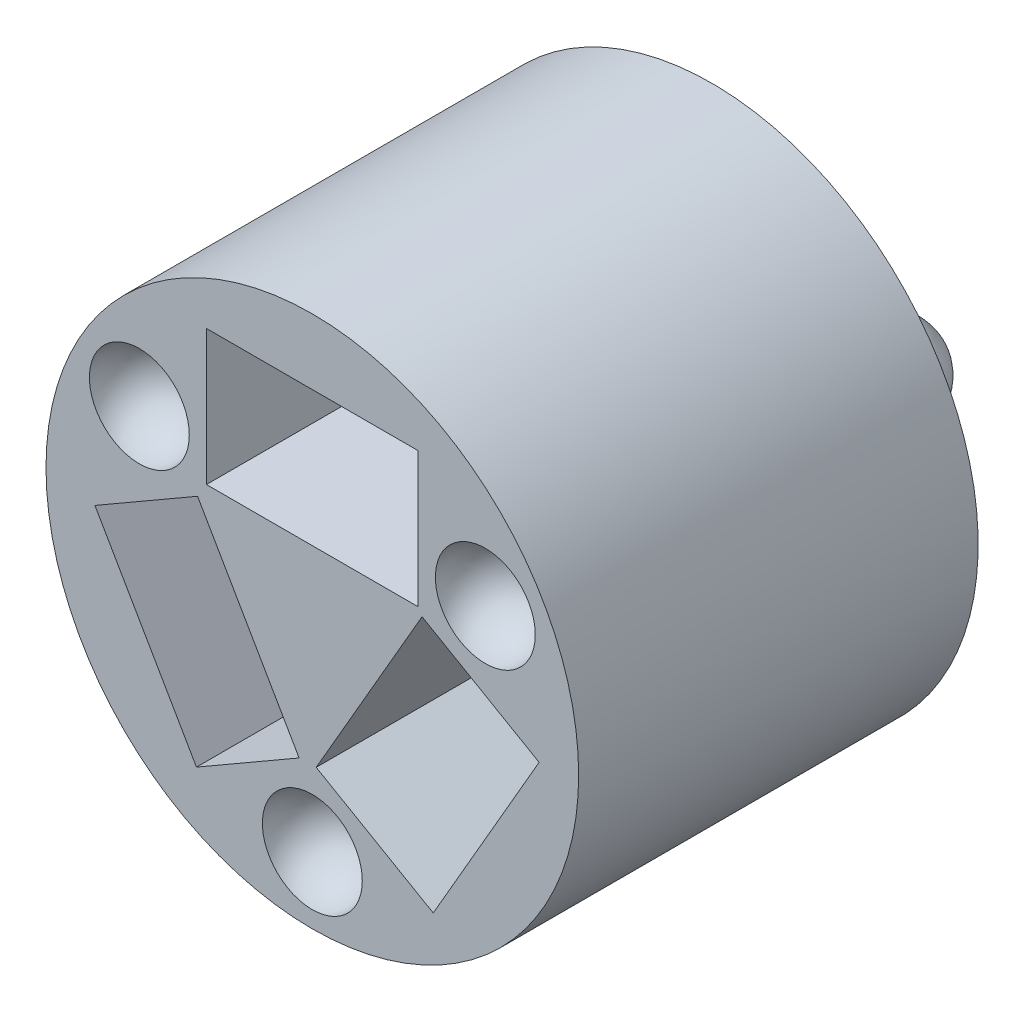
ISO-10303-21;
HEADER;
FILE_DESCRIPTION(('STEP AP214'),'2;1');
FILE_NAME('part.step','',(''),(''),'','','');
FILE_SCHEMA(('AUTOMOTIVE_DESIGN { 1 0 10303 214 1 1 1 1 }'));
ENDSEC;
DATA;
#1=APPLICATION_CONTEXT('core data for automotive mechanical design processes');
#2=APPLICATION_PROTOCOL_DEFINITION('international standard','automotive_design',2000,#1);
#3=PRODUCT_CONTEXT('',#1,'mechanical');
#4=PRODUCT('Part','Part','',(#3));
#5=PRODUCT_RELATED_PRODUCT_CATEGORY('part','',(#4));
#6=PRODUCT_DEFINITION_FORMATION('','',#4);
#7=PRODUCT_DEFINITION_CONTEXT('part definition',#1,'design');
#8=PRODUCT_DEFINITION('design','',#6,#7);
#9=PRODUCT_DEFINITION_SHAPE('','',#8);
#10=(LENGTH_UNIT() NAMED_UNIT(*) SI_UNIT(.MILLI.,.METRE.));
#11=(NAMED_UNIT(*) PLANE_ANGLE_UNIT() SI_UNIT($,.RADIAN.));
#12=(NAMED_UNIT(*) SI_UNIT($,.STERADIAN.) SOLID_ANGLE_UNIT());
#13=UNCERTAINTY_MEASURE_WITH_UNIT(LENGTH_MEASURE(1.E-05),#10,'distance_accuracy_value','');
#14=(GEOMETRIC_REPRESENTATION_CONTEXT(3) GLOBAL_UNCERTAINTY_ASSIGNED_CONTEXT((#13)) GLOBAL_UNIT_ASSIGNED_CONTEXT((#10,
#11,#12)) REPRESENTATION_CONTEXT('',''));
#15=CARTESIAN_POINT('',(0.,0.,0.));
#16=DIRECTION('',(0.,0.,1.));
#17=DIRECTION('',(1.,0.,0.));
#18=AXIS2_PLACEMENT_3D('',#15,#16,#17);
#19=CARTESIAN_POINT('',(0.,0.,5.));
#20=DIRECTION('',(0.,0.,1.));
#21=DIRECTION('',(1.,0.,0.));
#22=AXIS2_PLACEMENT_3D('',#19,#20,#21);
#23=PLANE('',#22);
#24=CARTESIAN_POINT('',(0.,-3.,5.));
#25=DIRECTION('',(0.,0.,1.));
#26=DIRECTION('',(1.,0.,0.));
#27=AXIS2_PLACEMENT_3D('',#24,#25,#26);
#28=CIRCLE('',#27,0.75);
#29=CARTESIAN_POINT('',(0.75,-3.,5.));
#30=VERTEX_POINT('',#29);
#31=EDGE_CURVE('E326',#30,#30,#28,.T.);
#32=ORIENTED_EDGE('',*,*,#31,.F.);
#33=EDGE_LOOP('',(#32));
#34=FACE_BOUND('',#33,.T.);
#35=CARTESIAN_POINT('',(-2.59807621135331,1.50000000000001,5.));
#36=DIRECTION('',(0.,0.,1.));
#37=DIRECTION('',(1.,0.,0.));
#38=AXIS2_PLACEMENT_3D('',#35,#36,#37);
#39=CIRCLE('',#38,0.75);
#40=CARTESIAN_POINT('',(-1.84807621135331,1.50000000000001,5.));
#41=VERTEX_POINT('',#40);
#42=EDGE_CURVE('E322',#41,#41,#39,.T.);
#43=ORIENTED_EDGE('',*,*,#42,.F.);
#44=EDGE_LOOP('',(#43));
#45=FACE_BOUND('',#44,.T.);
#46=CARTESIAN_POINT('',(2.59807621135333,1.49999999999998,5.));
#47=DIRECTION('',(0.,0.,1.));
#48=DIRECTION('',(1.,0.,0.));
#49=AXIS2_PLACEMENT_3D('',#46,#47,#48);
#50=CIRCLE('',#49,0.75);
#51=CARTESIAN_POINT('',(3.34807621135333,1.49999999999998,5.));
#52=VERTEX_POINT('',#51);
#53=EDGE_CURVE('E319',#52,#52,#50,.T.);
#54=ORIENTED_EDGE('',*,*,#53,.F.);
#55=EDGE_LOOP('',(#54));
#56=FACE_BOUND('',#55,.T.);
#57=CARTESIAN_POINT('',(0.,0.,5.));
#58=DIRECTION('',(0.,0.,1.));
#59=DIRECTION('',(1.,0.,0.));
#60=AXIS2_PLACEMENT_3D('',#57,#58,#59);
#61=CIRCLE('',#60,4.);
#62=CARTESIAN_POINT('',(4.,0.,5.));
#63=VERTEX_POINT('',#62);
#64=EDGE_CURVE('E11',#63,#63,#61,.T.);
#65=ORIENTED_EDGE('',*,*,#64,.T.);
#66=EDGE_LOOP('',(#65));
#67=FACE_BOUND('',#66,.T.);
#68=DIRECTION('',(-1.,0.,0.));
#69=VECTOR('',#68,1.);
#70=CARTESIAN_POINT('',(-1.59,3.015,5.));
#71=LINE('',#70,#69);
#72=CARTESIAN_POINT('',(1.59,3.015,5.));
#73=VERTEX_POINT('',#72);
#74=CARTESIAN_POINT('',(-1.59,3.015,5.));
#75=VERTEX_POINT('',#74);
#76=EDGE_CURVE('E215',#73,#75,#71,.T.);
#77=ORIENTED_EDGE('',*,*,#76,.F.);
#78=DIRECTION('',(0.,1.,0.));
#79=VECTOR('',#78,1.);
#80=CARTESIAN_POINT('',(1.59,0.985,5.));
#81=LINE('',#80,#79);
#82=CARTESIAN_POINT('',(1.59,0.985,5.));
#83=VERTEX_POINT('',#82);
#84=EDGE_CURVE('E212',#83,#73,#81,.T.);
#85=ORIENTED_EDGE('',*,*,#84,.F.);
#86=DIRECTION('',(1.,0.,0.));
#87=VECTOR('',#86,1.);
#88=CARTESIAN_POINT('',(-1.59,0.985,5.));
#89=LINE('',#88,#87);
#90=CARTESIAN_POINT('',(-1.59,0.985,5.));
#91=VERTEX_POINT('',#90);
#92=EDGE_CURVE('E223',#91,#83,#89,.T.);
#93=ORIENTED_EDGE('',*,*,#92,.F.);
#94=DIRECTION('',(0.,-1.,0.));
#95=VECTOR('',#94,1.);
#96=CARTESIAN_POINT('',(-1.59,0.985,5.));
#97=LINE('',#96,#95);
#98=EDGE_CURVE('E219',#75,#91,#97,.T.);
#99=ORIENTED_EDGE('',*,*,#98,.F.);
#100=EDGE_LOOP('',(#77,#85,#93,#99));
#101=FACE_BOUND('',#100,.T.);
#102=DIRECTION('',(0.866025403784439,0.5,0.));
#103=VECTOR('',#102,1.);
#104=CARTESIAN_POINT('',(-1.74031341693703,-2.76568874077127,5.));
#105=LINE('',#104,#103);
#106=CARTESIAN_POINT('',(-1.74031341693703,-2.76568874077127,5.));
#107=VERTEX_POINT('',#106);
#108=CARTESIAN_POINT('',(-0.198788198200727,-1.87568874077127,5.));
#109=VERTEX_POINT('',#108);
#110=EDGE_CURVE('E175',#107,#109,#105,.T.);
#111=ORIENTED_EDGE('',*,*,#110,.F.);
#112=DIRECTION('',(0.5,-0.866025403784439,0.));
#113=VECTOR('',#112,1.);
#114=CARTESIAN_POINT('',(-1.74031341693703,-2.76568874077127,5.));
#115=LINE('',#114,#113);
#116=CARTESIAN_POINT('',(-3.26531341693703,-0.124311259228731,5.));
#117=VERTEX_POINT('',#116);
#118=EDGE_CURVE('E172',#117,#107,#115,.T.);
#119=ORIENTED_EDGE('',*,*,#118,.F.);
#120=DIRECTION('',(-0.866025403784439,-0.5,0.));
#121=VECTOR('',#120,1.);
#122=CARTESIAN_POINT('',(-3.26531341693703,-0.124311259228731,5.));
#123=LINE('',#122,#121);
#124=CARTESIAN_POINT('',(-1.72378819820073,0.765688740771268,5.));
#125=VERTEX_POINT('',#124);
#126=EDGE_CURVE('E182',#125,#117,#123,.T.);
#127=ORIENTED_EDGE('',*,*,#126,.F.);
#128=DIRECTION('',(-0.5,0.866025403784439,0.));
#129=VECTOR('',#128,1.);
#130=CARTESIAN_POINT('',(-0.198788198200727,-1.87568874077127,5.));
#131=LINE('',#130,#129);
#132=EDGE_CURVE('E179',#109,#125,#131,.T.);
#133=ORIENTED_EDGE('',*,*,#132,.F.);
#134=EDGE_LOOP('',(#111,#119,#127,#133));
#135=FACE_BOUND('',#134,.T.);
#136=DIRECTION('',(-0.866025403784438,0.5,0.));
#137=VECTOR('',#136,1.);
#138=CARTESIAN_POINT('',(3.40606659241008,-0.130519607982743,5.));
#139=LINE('',#138,#137);
#140=CARTESIAN_POINT('',(3.40606659241008,-0.130519607982743,5.));
#141=VERTEX_POINT('',#140);
#142=CARTESIAN_POINT('',(1.64803502272767,0.884480392017257,5.));
#143=VERTEX_POINT('',#142);
#144=EDGE_CURVE('E159',#141,#143,#139,.T.);
#145=ORIENTED_EDGE('',*,*,#144,.F.);
#146=DIRECTION('',(0.5,0.866025403784438,0.));
#147=VECTOR('',#146,1.);
#148=CARTESIAN_POINT('',(3.40606659241008,-0.130519607982743,5.));
#149=LINE('',#148,#147);
#150=CARTESIAN_POINT('',(1.81606659241008,-2.88448039201726,5.));
#151=VERTEX_POINT('',#150);
#152=EDGE_CURVE('E155',#151,#141,#149,.T.);
#153=ORIENTED_EDGE('',*,*,#152,.F.);
#154=DIRECTION('',(0.866025403784439,-0.5,0.));
#155=VECTOR('',#154,1.);
#156=CARTESIAN_POINT('',(1.81606659241008,-2.88448039201726,5.));
#157=LINE('',#156,#155);
#158=CARTESIAN_POINT('',(0.0580350227276713,-1.86948039201726,5.));
#159=VERTEX_POINT('',#158);
#160=EDGE_CURVE('E134',#159,#151,#157,.T.);
#161=ORIENTED_EDGE('',*,*,#160,.F.);
#162=DIRECTION('',(-0.5,-0.866025403784438,0.));
#163=VECTOR('',#162,1.);
#164=CARTESIAN_POINT('',(1.64803502272767,0.884480392017257,5.));
#165=LINE('',#164,#163);
#166=EDGE_CURVE('E371',#143,#159,#165,.T.);
#167=ORIENTED_EDGE('',*,*,#166,.F.);
#168=EDGE_LOOP('',(#145,#153,#161,#167));
#169=FACE_BOUND('',#168,.T.);
#170=ADVANCED_FACE('F39',(#34,#45,#56,#67,#101,#135,#169),#23,.T.);
#171=CARTESIAN_POINT('',(0.,0.,5.));
#172=DIRECTION('',(0.,0.,-1.));
#173=DIRECTION('',(-1.,0.,0.));
#174=AXIS2_PLACEMENT_3D('',#171,#172,#173);
#175=CYLINDRICAL_SURFACE('',#174,4.);
#176=ORIENTED_EDGE('',*,*,#64,.F.);
#177=EDGE_LOOP('',(#176));
#178=FACE_BOUND('',#177,.T.);
#179=CARTESIAN_POINT('',(0.,0.,-1.));
#180=DIRECTION('',(0.,0.,-1.));
#181=DIRECTION('',(-1.,0.,0.));
#182=AXIS2_PLACEMENT_3D('',#179,#180,#181);
#183=CIRCLE('',#182,4.);
#184=CARTESIAN_POINT('',(-4.,0.,-1.));
#185=VERTEX_POINT('',#184);
#186=EDGE_CURVE('E149',#185,#185,#183,.T.);
#187=ORIENTED_EDGE('',*,*,#186,.F.);
#188=EDGE_LOOP('',(#187));
#189=FACE_BOUND('',#188,.T.);
#190=ADVANCED_FACE('F282',(#178,#189),#175,.T.);
#191=CARTESIAN_POINT('',(1.59,0.985,5.));
#192=DIRECTION('',(-1.,0.,0.));
#193=DIRECTION('',(0.,0.,1.));
#194=AXIS2_PLACEMENT_3D('',#191,#192,#193);
#195=PLANE('',#194);
#196=DIRECTION('',(0.,1.,0.));
#197=VECTOR('',#196,1.);
#198=CARTESIAN_POINT('',(1.59,0.985,0.));
#199=LINE('',#198,#197);
#200=CARTESIAN_POINT('',(1.59,0.985,0.));
#201=VERTEX_POINT('',#200);
#202=CARTESIAN_POINT('',(1.59,3.015,0.));
#203=VERTEX_POINT('',#202);
#204=EDGE_CURVE('E211',#201,#203,#199,.T.);
#205=ORIENTED_EDGE('',*,*,#204,.F.);
#206=DIRECTION('',(0.,0.,-1.));
#207=VECTOR('',#206,1.);
#208=CARTESIAN_POINT('',(1.59,0.985,5.));
#209=LINE('',#208,#207);
#210=EDGE_CURVE('E226',#83,#201,#209,.T.);
#211=ORIENTED_EDGE('',*,*,#210,.F.);
#212=ORIENTED_EDGE('',*,*,#84,.T.);
#213=DIRECTION('',(0.,0.,-1.));
#214=VECTOR('',#213,1.);
#215=CARTESIAN_POINT('',(1.59,3.015,5.));
#216=LINE('',#215,#214);
#217=EDGE_CURVE('E48',#73,#203,#216,.T.);
#218=ORIENTED_EDGE('',*,*,#217,.T.);
#219=EDGE_LOOP('',(#205,#211,#212,#218));
#220=FACE_BOUND('',#219,.T.);
#221=ADVANCED_FACE('F253',(#220),#195,.T.);
#222=CARTESIAN_POINT('',(-1.59,3.015,5.));
#223=DIRECTION('',(0.,-1.,0.));
#224=DIRECTION('',(0.,0.,-1.));
#225=AXIS2_PLACEMENT_3D('',#222,#223,#224);
#226=PLANE('',#225);
#227=DIRECTION('',(-1.,0.,0.));
#228=VECTOR('',#227,1.);
#229=CARTESIAN_POINT('',(-1.59,3.015,0.));
#230=LINE('',#229,#228);
#231=CARTESIAN_POINT('',(-1.59,3.015,0.));
#232=VERTEX_POINT('',#231);
#233=EDGE_CURVE('E230',#203,#232,#230,.T.);
#234=ORIENTED_EDGE('',*,*,#233,.F.);
#235=ORIENTED_EDGE('',*,*,#217,.F.);
#236=ORIENTED_EDGE('',*,*,#76,.T.);
#237=DIRECTION('',(0.,0.,-1.));
#238=VECTOR('',#237,1.);
#239=CARTESIAN_POINT('',(-1.59,3.015,5.));
#240=LINE('',#239,#238);
#241=EDGE_CURVE('E246',#75,#232,#240,.T.);
#242=ORIENTED_EDGE('',*,*,#241,.T.);
#243=EDGE_LOOP('',(#234,#235,#236,#242));
#244=FACE_BOUND('',#243,.T.);
#245=ADVANCED_FACE('F269',(#244),#226,.T.);
#246=CARTESIAN_POINT('',(-1.59,0.985,5.));
#247=DIRECTION('',(1.,0.,0.));
#248=DIRECTION('',(0.,0.,-1.));
#249=AXIS2_PLACEMENT_3D('',#246,#247,#248);
#250=PLANE('',#249);
#251=DIRECTION('',(0.,-1.,0.));
#252=VECTOR('',#251,1.);
#253=CARTESIAN_POINT('',(-1.59,0.985,0.));
#254=LINE('',#253,#252);
#255=CARTESIAN_POINT('',(-1.59,0.985,0.));
#256=VERTEX_POINT('',#255);
#257=EDGE_CURVE('E234',#232,#256,#254,.T.);
#258=ORIENTED_EDGE('',*,*,#257,.F.);
#259=ORIENTED_EDGE('',*,*,#241,.F.);
#260=ORIENTED_EDGE('',*,*,#98,.T.);
#261=DIRECTION('',(0.,0.,-1.));
#262=VECTOR('',#261,1.);
#263=CARTESIAN_POINT('',(-1.59,0.985,5.));
#264=LINE('',#263,#262);
#265=EDGE_CURVE('E243',#91,#256,#264,.T.);
#266=ORIENTED_EDGE('',*,*,#265,.T.);
#267=EDGE_LOOP('',(#258,#259,#260,#266));
#268=FACE_BOUND('',#267,.T.);
#269=ADVANCED_FACE('F271',(#268),#250,.T.);
#270=CARTESIAN_POINT('',(-1.59,0.985,5.));
#271=DIRECTION('',(0.,1.,0.));
#272=DIRECTION('',(0.,0.,1.));
#273=AXIS2_PLACEMENT_3D('',#270,#271,#272);
#274=PLANE('',#273);
#275=DIRECTION('',(1.,0.,0.));
#276=VECTOR('',#275,1.);
#277=CARTESIAN_POINT('',(-1.59,0.985,0.));
#278=LINE('',#277,#276);
#279=EDGE_CURVE('E216',#256,#201,#278,.T.);
#280=ORIENTED_EDGE('',*,*,#279,.F.);
#281=ORIENTED_EDGE('',*,*,#265,.F.);
#282=ORIENTED_EDGE('',*,*,#92,.T.);
#283=ORIENTED_EDGE('',*,*,#210,.T.);
#284=EDGE_LOOP('',(#280,#281,#282,#283));
#285=FACE_BOUND('',#284,.T.);
#286=ADVANCED_FACE('F263',(#285),#274,.T.);
#287=CARTESIAN_POINT('',(-1.74031341693703,-2.76568874077127,5.));
#288=DIRECTION('',(0.866025403784439,0.5,0.));
#289=DIRECTION('',(-0.5,0.866025403784439,0.));
#290=AXIS2_PLACEMENT_3D('',#287,#288,#289);
#291=PLANE('',#290);
#292=DIRECTION('',(0.5,-0.866025403784439,0.));
#293=VECTOR('',#292,1.);
#294=CARTESIAN_POINT('',(-1.74031341693703,-2.76568874077127,0.));
#295=LINE('',#294,#293);
#296=CARTESIAN_POINT('',(-3.26531341693703,-0.124311259228732,0.));
#297=VERTEX_POINT('',#296);
#298=CARTESIAN_POINT('',(-1.74031341693703,-2.76568874077127,0.));
#299=VERTEX_POINT('',#298);
#300=EDGE_CURVE('E171',#297,#299,#295,.T.);
#301=ORIENTED_EDGE('',*,*,#300,.F.);
#302=DIRECTION('',(0.,0.,-1.));
#303=VECTOR('',#302,1.);
#304=CARTESIAN_POINT('',(-3.26531341693703,-0.124311259228731,5.));
#305=LINE('',#304,#303);
#306=EDGE_CURVE('E185',#117,#297,#305,.T.);
#307=ORIENTED_EDGE('',*,*,#306,.F.);
#308=ORIENTED_EDGE('',*,*,#118,.T.);
#309=DIRECTION('',(0.,0.,-1.));
#310=VECTOR('',#309,1.);
#311=CARTESIAN_POINT('',(-1.74031341693703,-2.76568874077127,5.));
#312=LINE('',#311,#310);
#313=EDGE_CURVE('E207',#107,#299,#312,.T.);
#314=ORIENTED_EDGE('',*,*,#313,.T.);
#315=EDGE_LOOP('',(#301,#307,#308,#314));
#316=FACE_BOUND('',#315,.T.);
#317=ADVANCED_FACE('F278',(#316),#291,.T.);
#318=CARTESIAN_POINT('',(-1.74031341693703,-2.76568874077127,5.));
#319=DIRECTION('',(-0.5,0.866025403784439,0.));
#320=DIRECTION('',(-0.866025403784439,-0.5,0.));
#321=AXIS2_PLACEMENT_3D('',#318,#319,#320);
#322=PLANE('',#321);
#323=DIRECTION('',(0.866025403784439,0.5,0.));
#324=VECTOR('',#323,1.);
#325=CARTESIAN_POINT('',(-1.74031341693703,-2.76568874077127,0.));
#326=LINE('',#325,#324);
#327=CARTESIAN_POINT('',(-0.198788198200727,-1.87568874077127,0.));
#328=VERTEX_POINT('',#327);
#329=EDGE_CURVE('E189',#299,#328,#326,.T.);
#330=ORIENTED_EDGE('',*,*,#329,.F.);
#331=ORIENTED_EDGE('',*,*,#313,.F.);
#332=ORIENTED_EDGE('',*,*,#110,.T.);
#333=DIRECTION('',(0.,0.,-1.));
#334=VECTOR('',#333,1.);
#335=CARTESIAN_POINT('',(-0.198788198200727,-1.87568874077127,5.));
#336=LINE('',#335,#334);
#337=EDGE_CURVE('E204',#109,#328,#336,.T.);
#338=ORIENTED_EDGE('',*,*,#337,.T.);
#339=EDGE_LOOP('',(#330,#331,#332,#338));
#340=FACE_BOUND('',#339,.T.);
#341=ADVANCED_FACE('F403',(#340),#322,.T.);
#342=CARTESIAN_POINT('',(-0.198788198200727,-1.87568874077127,5.));
#343=DIRECTION('',(-0.866025403784439,-0.5,0.));
#344=DIRECTION('',(0.5,-0.866025403784439,0.));
#345=AXIS2_PLACEMENT_3D('',#342,#343,#344);
#346=PLANE('',#345);
#347=DIRECTION('',(-0.5,0.866025403784439,0.));
#348=VECTOR('',#347,1.);
#349=CARTESIAN_POINT('',(-0.198788198200727,-1.87568874077127,0.));
#350=LINE('',#349,#348);
#351=CARTESIAN_POINT('',(-1.72378819820073,0.765688740771268,0.));
#352=VERTEX_POINT('',#351);
#353=EDGE_CURVE('E193',#328,#352,#350,.T.);
#354=ORIENTED_EDGE('',*,*,#353,.F.);
#355=ORIENTED_EDGE('',*,*,#337,.F.);
#356=ORIENTED_EDGE('',*,*,#132,.T.);
#357=DIRECTION('',(0.,0.,-1.));
#358=VECTOR('',#357,1.);
#359=CARTESIAN_POINT('',(-1.72378819820073,0.765688740771268,5.));
#360=LINE('',#359,#358);
#361=EDGE_CURVE('E63',#125,#352,#360,.T.);
#362=ORIENTED_EDGE('',*,*,#361,.T.);
#363=EDGE_LOOP('',(#354,#355,#356,#362));
#364=FACE_BOUND('',#363,.T.);
#365=ADVANCED_FACE('F400',(#364),#346,.T.);
#366=CARTESIAN_POINT('',(-3.26531341693703,-0.124311259228731,5.));
#367=DIRECTION('',(0.5,-0.866025403784439,0.));
#368=DIRECTION('',(0.866025403784439,0.5,0.));
#369=AXIS2_PLACEMENT_3D('',#366,#367,#368);
#370=PLANE('',#369);
#371=DIRECTION('',(-0.866025403784439,-0.5,0.));
#372=VECTOR('',#371,1.);
#373=CARTESIAN_POINT('',(-3.26531341693703,-0.124311259228731,0.));
#374=LINE('',#373,#372);
#375=EDGE_CURVE('E176',#352,#297,#374,.T.);
#376=ORIENTED_EDGE('',*,*,#375,.F.);
#377=ORIENTED_EDGE('',*,*,#361,.F.);
#378=ORIENTED_EDGE('',*,*,#126,.T.);
#379=ORIENTED_EDGE('',*,*,#306,.T.);
#380=EDGE_LOOP('',(#376,#377,#378,#379));
#381=FACE_BOUND('',#380,.T.);
#382=ADVANCED_FACE('F397',(#381),#370,.T.);
#383=CARTESIAN_POINT('',(3.40606659241008,-0.130519607982743,5.));
#384=DIRECTION('',(-0.866025403784439,0.5,0.));
#385=DIRECTION('',(-0.5,-0.866025403784439,0.));
#386=AXIS2_PLACEMENT_3D('',#383,#384,#385);
#387=PLANE('',#386);
#388=DIRECTION('',(0.5,0.866025403784438,0.));
#389=VECTOR('',#388,1.);
#390=CARTESIAN_POINT('',(3.40606659241008,-0.130519607982743,0.));
#391=LINE('',#390,#389);
#392=CARTESIAN_POINT('',(1.81606659241008,-2.88448039201726,0.));
#393=VERTEX_POINT('',#392);
#394=CARTESIAN_POINT('',(3.40606659241008,-0.130519607982743,0.));
#395=VERTEX_POINT('',#394);
#396=EDGE_CURVE('E141',#393,#395,#391,.T.);
#397=ORIENTED_EDGE('',*,*,#396,.F.);
#398=DIRECTION('',(0.,0.,-1.));
#399=VECTOR('',#398,1.);
#400=CARTESIAN_POINT('',(1.81606659241008,-2.88448039201726,5.));
#401=LINE('',#400,#399);
#402=EDGE_CURVE('E127',#151,#393,#401,.T.);
#403=ORIENTED_EDGE('',*,*,#402,.F.);
#404=ORIENTED_EDGE('',*,*,#152,.T.);
#405=DIRECTION('',(0.,0.,-1.));
#406=VECTOR('',#405,1.);
#407=CARTESIAN_POINT('',(3.40606659241008,-0.130519607982743,5.));
#408=LINE('',#407,#406);
#409=EDGE_CURVE('E144',#141,#395,#408,.T.);
#410=ORIENTED_EDGE('',*,*,#409,.T.);
#411=EDGE_LOOP('',(#397,#403,#404,#410));
#412=FACE_BOUND('',#411,.T.);
#413=ADVANCED_FACE('F142',(#412),#387,.T.);
#414=CARTESIAN_POINT('',(3.40606659241008,-0.130519607982743,5.));
#415=DIRECTION('',(-0.5,-0.866025403784438,0.));
#416=DIRECTION('',(0.866025403784439,-0.5,0.));
#417=AXIS2_PLACEMENT_3D('',#414,#415,#416);
#418=PLANE('',#417);
#419=DIRECTION('',(-0.866025403784438,0.5,0.));
#420=VECTOR('',#419,1.);
#421=CARTESIAN_POINT('',(3.40606659241008,-0.130519607982743,0.));
#422=LINE('',#421,#420);
#423=CARTESIAN_POINT('',(1.64803502272767,0.884480392017257,0.));
#424=VERTEX_POINT('',#423);
#425=EDGE_CURVE('E148',#395,#424,#422,.T.);
#426=ORIENTED_EDGE('',*,*,#425,.F.);
#427=ORIENTED_EDGE('',*,*,#409,.F.);
#428=ORIENTED_EDGE('',*,*,#144,.T.);
#429=DIRECTION('',(0.,0.,-1.));
#430=VECTOR('',#429,1.);
#431=CARTESIAN_POINT('',(1.64803502272767,0.884480392017257,5.));
#432=LINE('',#431,#430);
#433=EDGE_CURVE('E166',#143,#424,#432,.T.);
#434=ORIENTED_EDGE('',*,*,#433,.T.);
#435=EDGE_LOOP('',(#426,#427,#428,#434));
#436=FACE_BOUND('',#435,.T.);
#437=ADVANCED_FACE('F377',(#436),#418,.T.);
#438=CARTESIAN_POINT('',(1.64803502272767,0.884480392017257,5.));
#439=DIRECTION('',(0.866025403784438,-0.5,0.));
#440=DIRECTION('',(0.5,0.866025403784439,0.));
#441=AXIS2_PLACEMENT_3D('',#438,#439,#440);
#442=PLANE('',#441);
#443=DIRECTION('',(-0.5,-0.866025403784438,0.));
#444=VECTOR('',#443,1.);
#445=CARTESIAN_POINT('',(1.64803502272767,0.884480392017257,0.));
#446=LINE('',#445,#444);
#447=CARTESIAN_POINT('',(0.0580350227276712,-1.86948039201726,0.));
#448=VERTEX_POINT('',#447);
#449=EDGE_CURVE('E153',#424,#448,#446,.T.);
#450=ORIENTED_EDGE('',*,*,#449,.F.);
#451=ORIENTED_EDGE('',*,*,#433,.F.);
#452=ORIENTED_EDGE('',*,*,#166,.T.);
#453=DIRECTION('',(0.,0.,-1.));
#454=VECTOR('',#453,1.);
#455=CARTESIAN_POINT('',(0.0580350227276712,-1.86948039201726,5.));
#456=LINE('',#455,#454);
#457=EDGE_CURVE('E55',#159,#448,#456,.T.);
#458=ORIENTED_EDGE('',*,*,#457,.T.);
#459=EDGE_LOOP('',(#450,#451,#452,#458));
#460=FACE_BOUND('',#459,.T.);
#461=ADVANCED_FACE('F382',(#460),#442,.T.);
#462=CARTESIAN_POINT('',(1.81606659241008,-2.88448039201726,5.));
#463=DIRECTION('',(0.5,0.866025403784439,0.));
#464=DIRECTION('',(-0.866025403784439,0.5,0.));
#465=AXIS2_PLACEMENT_3D('',#462,#463,#464);
#466=PLANE('',#465);
#467=DIRECTION('',(0.866025403784439,-0.5,0.));
#468=VECTOR('',#467,1.);
#469=CARTESIAN_POINT('',(1.81606659241008,-2.88448039201726,0.));
#470=LINE('',#469,#468);
#471=EDGE_CURVE('E131',#448,#393,#470,.T.);
#472=ORIENTED_EDGE('',*,*,#471,.F.);
#473=ORIENTED_EDGE('',*,*,#457,.F.);
#474=ORIENTED_EDGE('',*,*,#160,.T.);
#475=ORIENTED_EDGE('',*,*,#402,.T.);
#476=EDGE_LOOP('',(#472,#473,#474,#475));
#477=FACE_BOUND('',#476,.T.);
#478=ADVANCED_FACE('F129',(#477),#466,.T.);
#479=CARTESIAN_POINT('',(0.,0.,0.));
#480=DIRECTION('',(0.,0.,-1.));
#481=DIRECTION('',(-1.,0.,0.));
#482=AXIS2_PLACEMENT_3D('',#479,#480,#481);
#483=PLANE('',#482);
#484=CARTESIAN_POINT('',(-1.73205080756896,-0.999999999999951,0.));
#485=DIRECTION('',(0.,0.,-1.));
#486=DIRECTION('',(-1.,0.,0.));
#487=AXIS2_PLACEMENT_3D('',#484,#485,#486);
#488=CIRCLE('',#487,0.635000000000076);
#489=CARTESIAN_POINT('',(-2.36705080756904,-0.999999999999951,0.));
#490=VERTEX_POINT('',#489);
#491=EDGE_CURVE('E347',#490,#490,#488,.T.);
#492=ORIENTED_EDGE('',*,*,#491,.T.);
#493=EDGE_LOOP('',(#492));
#494=FACE_BOUND('',#493,.T.);
#495=ORIENTED_EDGE('',*,*,#375,.T.);
#496=ORIENTED_EDGE('',*,*,#300,.T.);
#497=ORIENTED_EDGE('',*,*,#329,.T.);
#498=ORIENTED_EDGE('',*,*,#353,.T.);
#499=EDGE_LOOP('',(#495,#496,#497,#498));
#500=FACE_BOUND('',#499,.T.);
#501=ADVANCED_FACE('F390',(#494,#500),#483,.F.);
#502=CARTESIAN_POINT('',(0.,2.,0.));
#503=DIRECTION('',(0.,0.,-1.));
#504=DIRECTION('',(-1.,0.,0.));
#505=AXIS2_PLACEMENT_3D('',#502,#503,#504);
#506=CIRCLE('',#505,0.635);
#507=CARTESIAN_POINT('',(-0.635,2.,0.));
#508=VERTEX_POINT('',#507);
#509=EDGE_CURVE('E355',#508,#508,#506,.T.);
#510=ORIENTED_EDGE('',*,*,#509,.T.);
#511=EDGE_LOOP('',(#510));
#512=FACE_BOUND('',#511,.T.);
#513=ORIENTED_EDGE('',*,*,#279,.T.);
#514=ORIENTED_EDGE('',*,*,#204,.T.);
#515=ORIENTED_EDGE('',*,*,#233,.T.);
#516=ORIENTED_EDGE('',*,*,#257,.T.);
#517=EDGE_LOOP('',(#513,#514,#515,#516));
#518=FACE_BOUND('',#517,.T.);
#519=ADVANCED_FACE('F259',(#512,#518),#483,.F.);
#520=CARTESIAN_POINT('',(1.73205080756879,-1.00000000000005,0.));
#521=DIRECTION('',(0.,0.,-1.));
#522=DIRECTION('',(-1.,0.,0.));
#523=AXIS2_PLACEMENT_3D('',#520,#521,#522);
#524=CIRCLE('',#523,0.635000000000114);
#525=CARTESIAN_POINT('',(1.09705080756868,-1.00000000000005,0.));
#526=VERTEX_POINT('',#525);
#527=EDGE_CURVE('E342',#526,#526,#524,.T.);
#528=ORIENTED_EDGE('',*,*,#527,.T.);
#529=EDGE_LOOP('',(#528));
#530=FACE_BOUND('',#529,.T.);
#531=ORIENTED_EDGE('',*,*,#471,.T.);
#532=ORIENTED_EDGE('',*,*,#396,.T.);
#533=ORIENTED_EDGE('',*,*,#425,.T.);
#534=ORIENTED_EDGE('',*,*,#449,.T.);
#535=EDGE_LOOP('',(#531,#532,#533,#534));
#536=FACE_BOUND('',#535,.T.);
#537=ADVANCED_FACE('F151',(#530,#536),#483,.F.);
#538=CARTESIAN_POINT('',(0.,0.,-1.));
#539=DIRECTION('',(0.,0.,-1.));
#540=DIRECTION('',(-1.,0.,0.));
#541=AXIS2_PLACEMENT_3D('',#538,#539,#540);
#542=PLANE('',#541);
#543=CARTESIAN_POINT('',(-2.59807621135333,1.49999999999998,-1.));
#544=DIRECTION('',(0.,0.,-1.));
#545=DIRECTION('',(-1.,0.,0.));
#546=AXIS2_PLACEMENT_3D('',#543,#544,#545);
#547=CIRCLE('',#546,0.725);
#548=CARTESIAN_POINT('',(-3.32307621135333,1.49999999999998,-1.));
#549=VERTEX_POINT('',#548);
#550=EDGE_CURVE('E330',#549,#549,#547,.T.);
#551=ORIENTED_EDGE('',*,*,#550,.F.);
#552=EDGE_LOOP('',(#551));
#553=FACE_BOUND('',#552,.T.);
#554=CARTESIAN_POINT('',(2.59807621135331,1.50000000000001,-1.));
#555=DIRECTION('',(0.,0.,-1.));
#556=DIRECTION('',(-1.,0.,0.));
#557=AXIS2_PLACEMENT_3D('',#554,#555,#556);
#558=CIRCLE('',#557,0.725);
#559=CARTESIAN_POINT('',(1.87307621135331,1.50000000000001,-1.));
#560=VERTEX_POINT('',#559);
#561=EDGE_CURVE('E334',#560,#560,#558,.T.);
#562=ORIENTED_EDGE('',*,*,#561,.F.);
#563=EDGE_LOOP('',(#562));
#564=FACE_BOUND('',#563,.T.);
#565=CARTESIAN_POINT('',(0.,-3.,-1.));
#566=DIRECTION('',(0.,0.,-1.));
#567=DIRECTION('',(-1.,0.,0.));
#568=AXIS2_PLACEMENT_3D('',#565,#566,#567);
#569=CIRCLE('',#568,0.725);
#570=CARTESIAN_POINT('',(-0.725,-3.,-1.));
#571=VERTEX_POINT('',#570);
#572=EDGE_CURVE('E338',#571,#571,#569,.T.);
#573=ORIENTED_EDGE('',*,*,#572,.F.);
#574=EDGE_LOOP('',(#573));
#575=FACE_BOUND('',#574,.T.);
#576=CARTESIAN_POINT('',(-1.73205080756896,-0.999999999999951,-1.));
#577=DIRECTION('',(0.,0.,-1.));
#578=DIRECTION('',(-1.,0.,0.));
#579=AXIS2_PLACEMENT_3D('',#576,#577,#578);
#580=CIRCLE('',#579,0.635000000000076);
#581=CARTESIAN_POINT('',(-2.36705080756904,-0.999999999999951,-1.));
#582=VERTEX_POINT('',#581);
#583=EDGE_CURVE('E351',#582,#582,#580,.T.);
#584=ORIENTED_EDGE('',*,*,#583,.F.);
#585=EDGE_LOOP('',(#584));
#586=FACE_BOUND('',#585,.T.);
#587=ORIENTED_EDGE('',*,*,#186,.T.);
#588=EDGE_LOOP('',(#587));
#589=FACE_BOUND('',#588,.T.);
#590=CARTESIAN_POINT('',(0.,2.,-1.));
#591=DIRECTION('',(0.,0.,-1.));
#592=DIRECTION('',(-1.,0.,0.));
#593=AXIS2_PLACEMENT_3D('',#590,#591,#592);
#594=CIRCLE('',#593,0.635);
#595=CARTESIAN_POINT('',(-0.635,2.,-1.));
#596=VERTEX_POINT('',#595);
#597=EDGE_CURVE('E359',#596,#596,#594,.T.);
#598=ORIENTED_EDGE('',*,*,#597,.F.);
#599=EDGE_LOOP('',(#598));
#600=FACE_BOUND('',#599,.T.);
#601=CARTESIAN_POINT('',(1.73205080756879,-1.00000000000005,-1.));
#602=DIRECTION('',(0.,0.,-1.));
#603=DIRECTION('',(-1.,0.,0.));
#604=AXIS2_PLACEMENT_3D('',#601,#602,#603);
#605=CIRCLE('',#604,0.635000000000114);
#606=CARTESIAN_POINT('',(1.09705080756868,-1.00000000000005,-1.));
#607=VERTEX_POINT('',#606);
#608=EDGE_CURVE('E343',#607,#607,#605,.T.);
#609=ORIENTED_EDGE('',*,*,#608,.F.);
#610=EDGE_LOOP('',(#609));
#611=FACE_BOUND('',#610,.T.);
#612=ADVANCED_FACE('F430',(#553,#564,#575,#586,#589,#600,#611),#542,.T.);
#613=CARTESIAN_POINT('',(0.,2.,-1.));
#614=DIRECTION('',(0.,0.,1.));
#615=DIRECTION('',(1.,0.,0.));
#616=AXIS2_PLACEMENT_3D('',#613,#614,#615);
#617=CYLINDRICAL_SURFACE('',#616,0.635);
#618=ORIENTED_EDGE('',*,*,#597,.T.);
#619=EDGE_LOOP('',(#618));
#620=FACE_BOUND('',#619,.T.);
#621=ORIENTED_EDGE('',*,*,#509,.F.);
#622=EDGE_LOOP('',(#621));
#623=FACE_BOUND('',#622,.T.);
#624=ADVANCED_FACE('F435',(#620,#623),#617,.F.);
#625=CARTESIAN_POINT('',(-1.73205080756896,-0.999999999999951,-1.));
#626=DIRECTION('',(0.,0.,1.));
#627=DIRECTION('',(1.,0.,0.));
#628=AXIS2_PLACEMENT_3D('',#625,#626,#627);
#629=CYLINDRICAL_SURFACE('',#628,0.635000000000076);
#630=ORIENTED_EDGE('',*,*,#583,.T.);
#631=EDGE_LOOP('',(#630));
#632=FACE_BOUND('',#631,.T.);
#633=ORIENTED_EDGE('',*,*,#491,.F.);
#634=EDGE_LOOP('',(#633));
#635=FACE_BOUND('',#634,.T.);
#636=ADVANCED_FACE('F440',(#632,#635),#629,.F.);
#637=CARTESIAN_POINT('',(1.73205080756879,-1.00000000000005,-1.));
#638=DIRECTION('',(0.,0.,1.));
#639=DIRECTION('',(1.,0.,0.));
#640=AXIS2_PLACEMENT_3D('',#637,#638,#639);
#641=CYLINDRICAL_SURFACE('',#640,0.635000000000114);
#642=ORIENTED_EDGE('',*,*,#608,.T.);
#643=EDGE_LOOP('',(#642));
#644=FACE_BOUND('',#643,.T.);
#645=ORIENTED_EDGE('',*,*,#527,.F.);
#646=EDGE_LOOP('',(#645));
#647=FACE_BOUND('',#646,.T.);
#648=ADVANCED_FACE('F298',(#644,#647),#641,.F.);
#649=CARTESIAN_POINT('',(0.,-3.,-1.));
#650=DIRECTION('',(0.,0.,-1.));
#651=DIRECTION('',(-1.,0.,0.));
#652=AXIS2_PLACEMENT_3D('',#649,#650,#651);
#653=SPHERICAL_SURFACE('',#652,0.725);
#654=ORIENTED_EDGE('',*,*,#572,.T.);
#655=EDGE_LOOP('',(#654));
#656=FACE_BOUND('',#655,.T.);
#657=ADVANCED_FACE('F294',(#656),#653,.T.);
#658=CARTESIAN_POINT('',(-2.59807621135333,1.49999999999998,-1.));
#659=DIRECTION('',(0.,0.,-1.));
#660=DIRECTION('',(-1.,0.,0.));
#661=AXIS2_PLACEMENT_3D('',#658,#659,#660);
#662=SPHERICAL_SURFACE('',#661,0.725);
#663=ORIENTED_EDGE('',*,*,#550,.T.);
#664=EDGE_LOOP('',(#663));
#665=FACE_BOUND('',#664,.T.);
#666=ADVANCED_FACE('F297',(#665),#662,.T.);
#667=CARTESIAN_POINT('',(2.59807621135331,1.50000000000001,-1.));
#668=DIRECTION('',(0.,0.,-1.));
#669=DIRECTION('',(-1.,0.,0.));
#670=AXIS2_PLACEMENT_3D('',#667,#668,#669);
#671=SPHERICAL_SURFACE('',#670,0.725);
#672=ORIENTED_EDGE('',*,*,#561,.T.);
#673=EDGE_LOOP('',(#672));
#674=FACE_BOUND('',#673,.T.);
#675=ADVANCED_FACE('F302',(#674),#671,.T.);
#676=CARTESIAN_POINT('',(0.,-3.,5.));
#677=DIRECTION('',(0.,0.,1.));
#678=DIRECTION('',(1.,0.,0.));
#679=AXIS2_PLACEMENT_3D('',#676,#677,#678);
#680=SPHERICAL_SURFACE('',#679,0.75);
#681=ORIENTED_EDGE('',*,*,#31,.T.);
#682=EDGE_LOOP('',(#681));
#683=FACE_BOUND('',#682,.T.);
#684=ADVANCED_FACE('F306',(#683),#680,.F.);
#685=CARTESIAN_POINT('',(2.59807621135333,1.49999999999998,5.));
#686=DIRECTION('',(0.,0.,1.));
#687=DIRECTION('',(1.,0.,0.));
#688=AXIS2_PLACEMENT_3D('',#685,#686,#687);
#689=SPHERICAL_SURFACE('',#688,0.75);
#690=ORIENTED_EDGE('',*,*,#53,.T.);
#691=EDGE_LOOP('',(#690));
#692=FACE_BOUND('',#691,.T.);
#693=ADVANCED_FACE('F309',(#692),#689,.F.);
#694=CARTESIAN_POINT('',(-2.59807621135331,1.50000000000001,5.));
#695=DIRECTION('',(0.,0.,1.));
#696=DIRECTION('',(1.,0.,0.));
#697=AXIS2_PLACEMENT_3D('',#694,#695,#696);
#698=SPHERICAL_SURFACE('',#697,0.75);
#699=ORIENTED_EDGE('',*,*,#42,.T.);
#700=EDGE_LOOP('',(#699));
#701=FACE_BOUND('',#700,.T.);
#702=ADVANCED_FACE('F41',(#701),#698,.F.);
#703=CLOSED_SHELL('',(#170,#190,#221,#245,#269,#286,#317,#341,#365,#382,#413,#437,#461,#478,
#501,#519,#537,#612,#624,#636,#648,#657,#666,#675,#684,#693,#702));
#704=MANIFOLD_SOLID_BREP('B2',#703);
#705=ADVANCED_BREP_SHAPE_REPRESENTATION('',(#18,#704),#14);
#706=SHAPE_DEFINITION_REPRESENTATION(#9,#705);
ENDSEC;
END-ISO-10303-21;
